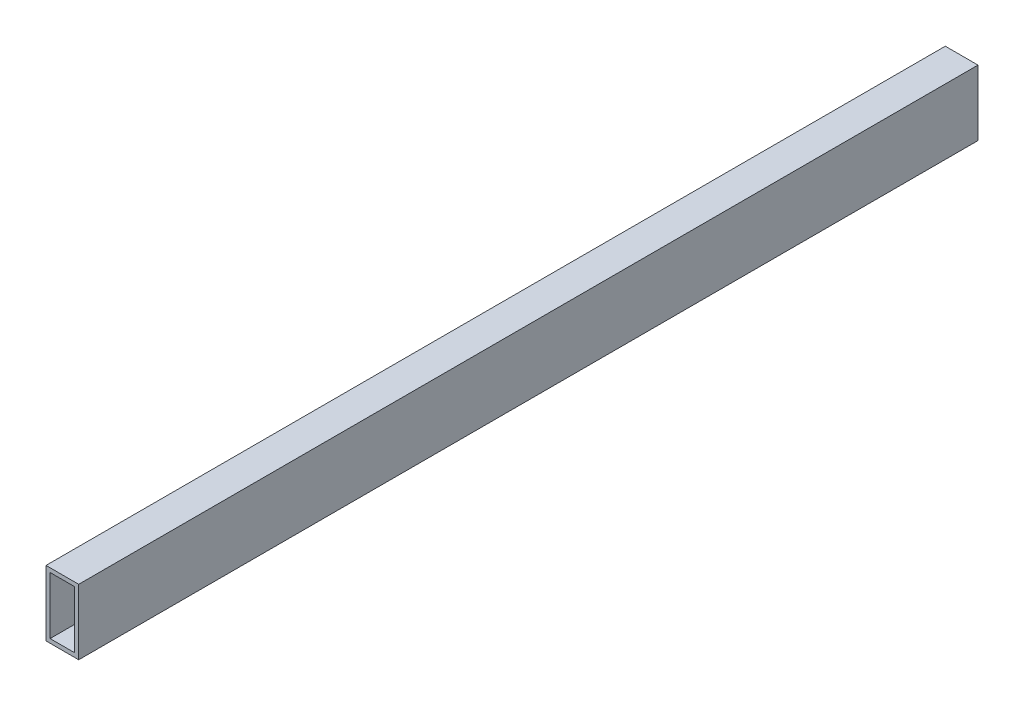
ISO-10303-21;
HEADER;
FILE_DESCRIPTION(('STEP AP214'),'2;1');
FILE_NAME('part.step','',(''),(''),'','','');
FILE_SCHEMA(('AUTOMOTIVE_DESIGN { 1 0 10303 214 1 1 1 1 }'));
ENDSEC;
DATA;
#1=APPLICATION_CONTEXT('core data for automotive mechanical design processes');
#2=APPLICATION_PROTOCOL_DEFINITION('international standard','automotive_design',2000,#1);
#3=PRODUCT_CONTEXT('',#1,'mechanical');
#4=PRODUCT('Part','Part','',(#3));
#5=PRODUCT_RELATED_PRODUCT_CATEGORY('part','',(#4));
#6=PRODUCT_DEFINITION_FORMATION('','',#4);
#7=PRODUCT_DEFINITION_CONTEXT('part definition',#1,'design');
#8=PRODUCT_DEFINITION('design','',#6,#7);
#9=PRODUCT_DEFINITION_SHAPE('','',#8);
#10=(LENGTH_UNIT() NAMED_UNIT(*) SI_UNIT(.MILLI.,.METRE.));
#11=(NAMED_UNIT(*) PLANE_ANGLE_UNIT() SI_UNIT($,.RADIAN.));
#12=(NAMED_UNIT(*) SI_UNIT($,.STERADIAN.) SOLID_ANGLE_UNIT());
#13=UNCERTAINTY_MEASURE_WITH_UNIT(LENGTH_MEASURE(1.E-05),#10,'distance_accuracy_value','');
#14=(GEOMETRIC_REPRESENTATION_CONTEXT(3) GLOBAL_UNCERTAINTY_ASSIGNED_CONTEXT((#13)) GLOBAL_UNIT_ASSIGNED_CONTEXT((#10,
#11,#12)) REPRESENTATION_CONTEXT('',''));
#15=CARTESIAN_POINT('',(0.,0.,0.));
#16=DIRECTION('',(0.,0.,1.));
#17=DIRECTION('',(1.,0.,0.));
#18=AXIS2_PLACEMENT_3D('',#15,#16,#17);
#19=CARTESIAN_POINT('',(0.,0.,349.25));
#20=DIRECTION('',(0.,0.,1.));
#21=DIRECTION('',(1.,0.,0.));
#22=AXIS2_PLACEMENT_3D('',#19,#20,#21);
#23=PLANE('',#22);
#24=DIRECTION('',(0.,1.,0.));
#25=VECTOR('',#24,1.);
#26=CARTESIAN_POINT('',(12.7,25.4,349.25));
#27=LINE('',#26,#25);
#28=CARTESIAN_POINT('',(12.7,-25.4,349.25));
#29=VERTEX_POINT('',#28);
#30=CARTESIAN_POINT('',(12.7,25.4,349.25));
#31=VERTEX_POINT('',#30);
#32=EDGE_CURVE('E134',#29,#31,#27,.T.);
#33=ORIENTED_EDGE('',*,*,#32,.T.);
#34=DIRECTION('',(-1.,0.,0.));
#35=VECTOR('',#34,1.);
#36=CARTESIAN_POINT('',(-12.7,25.4,349.25));
#37=LINE('',#36,#35);
#38=CARTESIAN_POINT('',(-12.7,25.4,349.25));
#39=VERTEX_POINT('',#38);
#40=EDGE_CURVE('E137',#31,#39,#37,.T.);
#41=ORIENTED_EDGE('',*,*,#40,.T.);
#42=DIRECTION('',(0.,-1.,0.));
#43=VECTOR('',#42,1.);
#44=CARTESIAN_POINT('',(-12.7,25.4,349.25));
#45=LINE('',#44,#43);
#46=CARTESIAN_POINT('',(-12.7,-25.4,349.25));
#47=VERTEX_POINT('',#46);
#48=EDGE_CURVE('E140',#39,#47,#45,.T.);
#49=ORIENTED_EDGE('',*,*,#48,.T.);
#50=DIRECTION('',(1.,0.,0.));
#51=VECTOR('',#50,1.);
#52=CARTESIAN_POINT('',(-12.7,-25.4,349.25));
#53=LINE('',#52,#51);
#54=EDGE_CURVE('E142',#47,#29,#53,.T.);
#55=ORIENTED_EDGE('',*,*,#54,.T.);
#56=EDGE_LOOP('',(#33,#41,#49,#55));
#57=FACE_BOUND('',#56,.T.);
#58=DIRECTION('',(1.,0.,0.));
#59=VECTOR('',#58,1.);
#60=CARTESIAN_POINT('',(-9.525,-22.225,349.25));
#61=LINE('',#60,#59);
#62=CARTESIAN_POINT('',(-9.525,-22.225,349.25));
#63=VERTEX_POINT('',#62);
#64=CARTESIAN_POINT('',(9.52500000000001,-22.225,349.25));
#65=VERTEX_POINT('',#64);
#66=EDGE_CURVE('E106',#63,#65,#61,.T.);
#67=ORIENTED_EDGE('',*,*,#66,.F.);
#68=DIRECTION('',(0.,-1.,0.));
#69=VECTOR('',#68,1.);
#70=CARTESIAN_POINT('',(-9.525,22.225,349.25));
#71=LINE('',#70,#69);
#72=CARTESIAN_POINT('',(-9.525,22.225,349.25));
#73=VERTEX_POINT('',#72);
#74=EDGE_CURVE('E98',#73,#63,#71,.T.);
#75=ORIENTED_EDGE('',*,*,#74,.F.);
#76=DIRECTION('',(-1.,0.,0.));
#77=VECTOR('',#76,1.);
#78=CARTESIAN_POINT('',(-9.525,22.225,349.25));
#79=LINE('',#78,#77);
#80=CARTESIAN_POINT('',(9.525,22.225,349.25));
#81=VERTEX_POINT('',#80);
#82=EDGE_CURVE('E120',#81,#73,#79,.T.);
#83=ORIENTED_EDGE('',*,*,#82,.F.);
#84=DIRECTION('',(0.,1.,0.));
#85=VECTOR('',#84,1.);
#86=CARTESIAN_POINT('',(9.525,22.225,349.25));
#87=LINE('',#86,#85);
#88=EDGE_CURVE('E118',#65,#81,#87,.T.);
#89=ORIENTED_EDGE('',*,*,#88,.F.);
#90=EDGE_LOOP('',(#67,#75,#83,#89));
#91=FACE_BOUND('',#90,.T.);
#92=ADVANCED_FACE('F33',(#57,#91),#23,.T.);
#93=CARTESIAN_POINT('',(0.,0.,-349.25));
#94=DIRECTION('',(0.,0.,1.));
#95=DIRECTION('',(1.,0.,0.));
#96=AXIS2_PLACEMENT_3D('',#93,#94,#95);
#97=PLANE('',#96);
#98=DIRECTION('',(0.,1.,0.));
#99=VECTOR('',#98,1.);
#100=CARTESIAN_POINT('',(12.7,25.4,-349.25));
#101=LINE('',#100,#99);
#102=CARTESIAN_POINT('',(12.7,-25.4,-349.25));
#103=VERTEX_POINT('',#102);
#104=CARTESIAN_POINT('',(12.7,25.4,-349.25));
#105=VERTEX_POINT('',#104);
#106=EDGE_CURVE('E114',#103,#105,#101,.T.);
#107=ORIENTED_EDGE('',*,*,#106,.F.);
#108=DIRECTION('',(1.,0.,0.));
#109=VECTOR('',#108,1.);
#110=CARTESIAN_POINT('',(-12.7,-25.4,-349.25));
#111=LINE('',#110,#109);
#112=CARTESIAN_POINT('',(-12.7,-25.4,-349.25));
#113=VERTEX_POINT('',#112);
#114=EDGE_CURVE('E138',#113,#103,#111,.T.);
#115=ORIENTED_EDGE('',*,*,#114,.F.);
#116=DIRECTION('',(0.,-1.,0.));
#117=VECTOR('',#116,1.);
#118=CARTESIAN_POINT('',(-12.7,25.4,-349.25));
#119=LINE('',#118,#117);
#120=CARTESIAN_POINT('',(-12.7,25.4,-349.25));
#121=VERTEX_POINT('',#120);
#122=EDGE_CURVE('E149',#121,#113,#119,.T.);
#123=ORIENTED_EDGE('',*,*,#122,.F.);
#124=DIRECTION('',(-1.,0.,0.));
#125=VECTOR('',#124,1.);
#126=CARTESIAN_POINT('',(-12.7,25.4,-349.25));
#127=LINE('',#126,#125);
#128=EDGE_CURVE('E147',#105,#121,#127,.T.);
#129=ORIENTED_EDGE('',*,*,#128,.F.);
#130=EDGE_LOOP('',(#107,#115,#123,#129));
#131=FACE_BOUND('',#130,.T.);
#132=DIRECTION('',(0.,-1.,0.));
#133=VECTOR('',#132,1.);
#134=CARTESIAN_POINT('',(-9.525,22.225,-349.25));
#135=LINE('',#134,#133);
#136=CARTESIAN_POINT('',(-9.525,22.225,-349.25));
#137=VERTEX_POINT('',#136);
#138=CARTESIAN_POINT('',(-9.525,-22.225,-349.25));
#139=VERTEX_POINT('',#138);
#140=EDGE_CURVE('E56',#137,#139,#135,.T.);
#141=ORIENTED_EDGE('',*,*,#140,.T.);
#142=DIRECTION('',(1.,0.,0.));
#143=VECTOR('',#142,1.);
#144=CARTESIAN_POINT('',(-9.525,-22.225,-349.25));
#145=LINE('',#144,#143);
#146=CARTESIAN_POINT('',(9.52500000000001,-22.225,-349.25));
#147=VERTEX_POINT('',#146);
#148=EDGE_CURVE('E113',#139,#147,#145,.T.);
#149=ORIENTED_EDGE('',*,*,#148,.T.);
#150=DIRECTION('',(0.,1.,0.));
#151=VECTOR('',#150,1.);
#152=CARTESIAN_POINT('',(9.525,22.225,-349.25));
#153=LINE('',#152,#151);
#154=CARTESIAN_POINT('',(9.525,22.225,-349.25));
#155=VERTEX_POINT('',#154);
#156=EDGE_CURVE('E126',#147,#155,#153,.T.);
#157=ORIENTED_EDGE('',*,*,#156,.T.);
#158=DIRECTION('',(-1.,0.,0.));
#159=VECTOR('',#158,1.);
#160=CARTESIAN_POINT('',(-9.525,22.225,-349.25));
#161=LINE('',#160,#159);
#162=EDGE_CURVE('E107',#155,#137,#161,.T.);
#163=ORIENTED_EDGE('',*,*,#162,.T.);
#164=EDGE_LOOP('',(#141,#149,#157,#163));
#165=FACE_BOUND('',#164,.T.);
#166=ADVANCED_FACE('F167',(#131,#165),#97,.F.);
#167=CARTESIAN_POINT('',(12.7,25.4,349.25));
#168=DIRECTION('',(-1.,0.,0.));
#169=DIRECTION('',(0.,-1.,0.));
#170=AXIS2_PLACEMENT_3D('',#167,#168,#169);
#171=PLANE('',#170);
#172=ORIENTED_EDGE('',*,*,#106,.T.);
#173=DIRECTION('',(0.,0.,-1.));
#174=VECTOR('',#173,1.);
#175=CARTESIAN_POINT('',(12.7,25.4,349.25));
#176=LINE('',#175,#174);
#177=EDGE_CURVE('E11',#31,#105,#176,.T.);
#178=ORIENTED_EDGE('',*,*,#177,.F.);
#179=ORIENTED_EDGE('',*,*,#32,.F.);
#180=DIRECTION('',(0.,0.,-1.));
#181=VECTOR('',#180,1.);
#182=CARTESIAN_POINT('',(12.7,-25.4,349.25));
#183=LINE('',#182,#181);
#184=EDGE_CURVE('E144',#29,#103,#183,.T.);
#185=ORIENTED_EDGE('',*,*,#184,.T.);
#186=EDGE_LOOP('',(#172,#178,#179,#185));
#187=FACE_BOUND('',#186,.T.);
#188=ADVANCED_FACE('F35',(#187),#171,.F.);
#189=CARTESIAN_POINT('',(-12.7,25.4,349.25));
#190=DIRECTION('',(0.,-1.,0.));
#191=DIRECTION('',(0.,0.,-1.));
#192=AXIS2_PLACEMENT_3D('',#189,#190,#191);
#193=PLANE('',#192);
#194=ORIENTED_EDGE('',*,*,#128,.T.);
#195=DIRECTION('',(0.,0.,-1.));
#196=VECTOR('',#195,1.);
#197=CARTESIAN_POINT('',(-12.7,25.4,349.25));
#198=LINE('',#197,#196);
#199=EDGE_CURVE('E41',#39,#121,#198,.T.);
#200=ORIENTED_EDGE('',*,*,#199,.F.);
#201=ORIENTED_EDGE('',*,*,#40,.F.);
#202=ORIENTED_EDGE('',*,*,#177,.T.);
#203=EDGE_LOOP('',(#194,#200,#201,#202));
#204=FACE_BOUND('',#203,.T.);
#205=ADVANCED_FACE('F177',(#204),#193,.F.);
#206=CARTESIAN_POINT('',(-12.7,25.4,349.25));
#207=DIRECTION('',(1.,0.,0.));
#208=DIRECTION('',(0.,1.,0.));
#209=AXIS2_PLACEMENT_3D('',#206,#207,#208);
#210=PLANE('',#209);
#211=ORIENTED_EDGE('',*,*,#122,.T.);
#212=DIRECTION('',(0.,0.,-1.));
#213=VECTOR('',#212,1.);
#214=CARTESIAN_POINT('',(-12.7,-25.4,349.25));
#215=LINE('',#214,#213);
#216=EDGE_CURVE('E154',#47,#113,#215,.T.);
#217=ORIENTED_EDGE('',*,*,#216,.F.);
#218=ORIENTED_EDGE('',*,*,#48,.F.);
#219=ORIENTED_EDGE('',*,*,#199,.T.);
#220=EDGE_LOOP('',(#211,#217,#218,#219));
#221=FACE_BOUND('',#220,.T.);
#222=ADVANCED_FACE('F161',(#221),#210,.F.);
#223=CARTESIAN_POINT('',(-12.7,-25.4,349.25));
#224=DIRECTION('',(0.,1.,0.));
#225=DIRECTION('',(0.,0.,1.));
#226=AXIS2_PLACEMENT_3D('',#223,#224,#225);
#227=PLANE('',#226);
#228=ORIENTED_EDGE('',*,*,#114,.T.);
#229=ORIENTED_EDGE('',*,*,#184,.F.);
#230=ORIENTED_EDGE('',*,*,#54,.F.);
#231=ORIENTED_EDGE('',*,*,#216,.T.);
#232=EDGE_LOOP('',(#228,#229,#230,#231));
#233=FACE_BOUND('',#232,.T.);
#234=ADVANCED_FACE('F171',(#233),#227,.F.);
#235=CARTESIAN_POINT('',(-9.525,22.225,349.25));
#236=DIRECTION('',(1.,0.,0.));
#237=DIRECTION('',(0.,1.,0.));
#238=AXIS2_PLACEMENT_3D('',#235,#236,#237);
#239=PLANE('',#238);
#240=ORIENTED_EDGE('',*,*,#140,.F.);
#241=DIRECTION('',(0.,0.,-1.));
#242=VECTOR('',#241,1.);
#243=CARTESIAN_POINT('',(-9.525,22.225,349.25));
#244=LINE('',#243,#242);
#245=EDGE_CURVE('E102',#73,#137,#244,.T.);
#246=ORIENTED_EDGE('',*,*,#245,.F.);
#247=ORIENTED_EDGE('',*,*,#74,.T.);
#248=DIRECTION('',(0.,0.,-1.));
#249=VECTOR('',#248,1.);
#250=CARTESIAN_POINT('',(-9.525,-22.225,349.25));
#251=LINE('',#250,#249);
#252=EDGE_CURVE('E101',#63,#139,#251,.T.);
#253=ORIENTED_EDGE('',*,*,#252,.T.);
#254=EDGE_LOOP('',(#240,#246,#247,#253));
#255=FACE_BOUND('',#254,.T.);
#256=ADVANCED_FACE('F100',(#255),#239,.T.);
#257=CARTESIAN_POINT('',(-9.525,-22.225,349.25));
#258=DIRECTION('',(0.,1.,0.));
#259=DIRECTION('',(-1.,0.,0.));
#260=AXIS2_PLACEMENT_3D('',#257,#258,#259);
#261=PLANE('',#260);
#262=ORIENTED_EDGE('',*,*,#148,.F.);
#263=ORIENTED_EDGE('',*,*,#252,.F.);
#264=ORIENTED_EDGE('',*,*,#66,.T.);
#265=DIRECTION('',(0.,0.,-1.));
#266=VECTOR('',#265,1.);
#267=CARTESIAN_POINT('',(9.52500000000001,-22.225,349.25));
#268=LINE('',#267,#266);
#269=EDGE_CURVE('E115',#65,#147,#268,.T.);
#270=ORIENTED_EDGE('',*,*,#269,.T.);
#271=EDGE_LOOP('',(#262,#263,#264,#270));
#272=FACE_BOUND('',#271,.T.);
#273=ADVANCED_FACE('F110',(#272),#261,.T.);
#274=CARTESIAN_POINT('',(9.525,22.225,349.25));
#275=DIRECTION('',(-1.,0.,0.));
#276=DIRECTION('',(0.,-1.,0.));
#277=AXIS2_PLACEMENT_3D('',#274,#275,#276);
#278=PLANE('',#277);
#279=ORIENTED_EDGE('',*,*,#156,.F.);
#280=ORIENTED_EDGE('',*,*,#269,.F.);
#281=ORIENTED_EDGE('',*,*,#88,.T.);
#282=DIRECTION('',(0.,0.,-1.));
#283=VECTOR('',#282,1.);
#284=CARTESIAN_POINT('',(9.525,22.225,349.25));
#285=LINE('',#284,#283);
#286=EDGE_CURVE('E48',#81,#155,#285,.T.);
#287=ORIENTED_EDGE('',*,*,#286,.T.);
#288=EDGE_LOOP('',(#279,#280,#281,#287));
#289=FACE_BOUND('',#288,.T.);
#290=ADVANCED_FACE('F200',(#289),#278,.T.);
#291=CARTESIAN_POINT('',(-9.525,22.225,349.25));
#292=DIRECTION('',(0.,-1.,0.));
#293=DIRECTION('',(0.,0.,-1.));
#294=AXIS2_PLACEMENT_3D('',#291,#292,#293);
#295=PLANE('',#294);
#296=ORIENTED_EDGE('',*,*,#162,.F.);
#297=ORIENTED_EDGE('',*,*,#286,.F.);
#298=ORIENTED_EDGE('',*,*,#82,.T.);
#299=ORIENTED_EDGE('',*,*,#245,.T.);
#300=EDGE_LOOP('',(#296,#297,#298,#299));
#301=FACE_BOUND('',#300,.T.);
#302=ADVANCED_FACE('F204',(#301),#295,.T.);
#303=CLOSED_SHELL('',(#92,#166,#188,#205,#222,#234,#256,#273,#290,#302));
#304=MANIFOLD_SOLID_BREP('B2',#303);
#305=ADVANCED_BREP_SHAPE_REPRESENTATION('',(#18,#304),#14);
#306=SHAPE_DEFINITION_REPRESENTATION(#9,#305);
ENDSEC;
END-ISO-10303-21;
